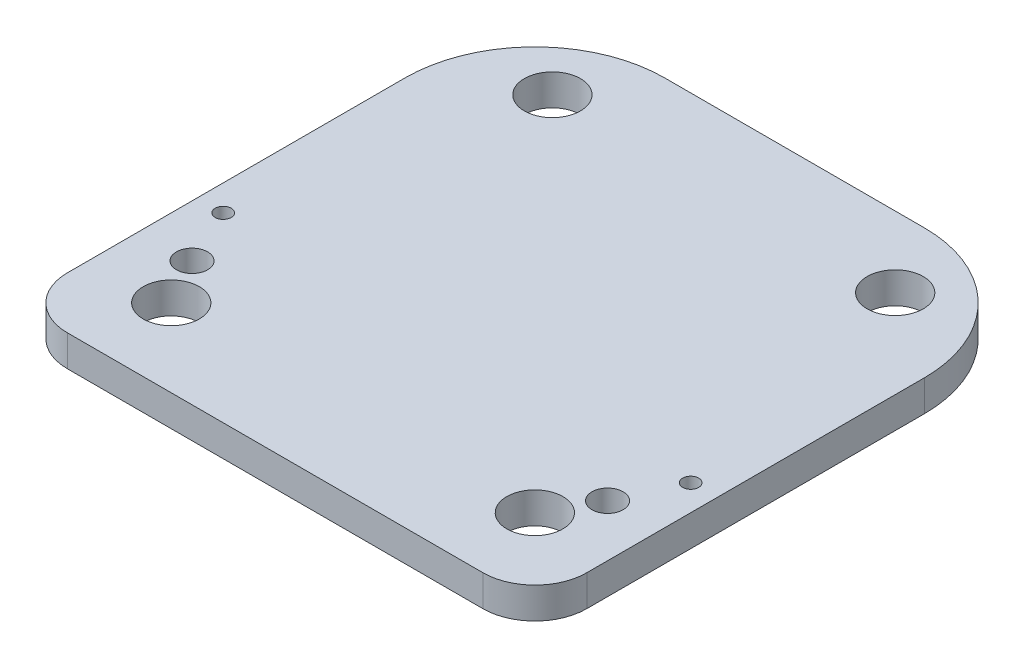
ISO-10303-21;
HEADER;
FILE_DESCRIPTION(('STEP AP214'),'2;1');
FILE_NAME('part.step','',(''),(''),'','','');
FILE_SCHEMA(('AUTOMOTIVE_DESIGN { 1 0 10303 214 1 1 1 1 }'));
ENDSEC;
DATA;
#1=APPLICATION_CONTEXT('core data for automotive mechanical design processes');
#2=APPLICATION_PROTOCOL_DEFINITION('international standard','automotive_design',2000,#1);
#3=PRODUCT_CONTEXT('',#1,'mechanical');
#4=PRODUCT('Part','Part','',(#3));
#5=PRODUCT_RELATED_PRODUCT_CATEGORY('part','',(#4));
#6=PRODUCT_DEFINITION_FORMATION('','',#4);
#7=PRODUCT_DEFINITION_CONTEXT('part definition',#1,'design');
#8=PRODUCT_DEFINITION('design','',#6,#7);
#9=PRODUCT_DEFINITION_SHAPE('','',#8);
#10=(LENGTH_UNIT() NAMED_UNIT(*) SI_UNIT(.MILLI.,.METRE.));
#11=(NAMED_UNIT(*) PLANE_ANGLE_UNIT() SI_UNIT($,.RADIAN.));
#12=(NAMED_UNIT(*) SI_UNIT($,.STERADIAN.) SOLID_ANGLE_UNIT());
#13=UNCERTAINTY_MEASURE_WITH_UNIT(LENGTH_MEASURE(1.E-05),#10,'distance_accuracy_value','');
#14=(GEOMETRIC_REPRESENTATION_CONTEXT(3) GLOBAL_UNCERTAINTY_ASSIGNED_CONTEXT((#13)) GLOBAL_UNIT_ASSIGNED_CONTEXT((#10,
#11,#12)) REPRESENTATION_CONTEXT('',''));
#15=CARTESIAN_POINT('',(0.,0.,0.));
#16=DIRECTION('',(0.,0.,1.));
#17=DIRECTION('',(1.,0.,0.));
#18=AXIS2_PLACEMENT_3D('',#15,#16,#17);
#19=CARTESIAN_POINT('',(10.,-6.,-10.));
#20=DIRECTION('',(0.,1.,0.));
#21=DIRECTION('',(0.,0.,1.));
#22=AXIS2_PLACEMENT_3D('',#19,#20,#21);
#23=CYLINDRICAL_SURFACE('',#22,10.);
#24=CARTESIAN_POINT('',(10.,0.,-10.));
#25=DIRECTION('',(0.,1.,0.));
#26=DIRECTION('',(0.,0.,1.));
#27=AXIS2_PLACEMENT_3D('',#24,#25,#26);
#28=CIRCLE('',#27,10.);
#29=CARTESIAN_POINT('',(0.,0.,-9.99999999999999));
#30=VERTEX_POINT('',#29);
#31=CARTESIAN_POINT('',(10.,0.,0.));
#32=VERTEX_POINT('',#31);
#33=EDGE_CURVE('E144',#30,#32,#28,.T.);
#34=ORIENTED_EDGE('',*,*,#33,.F.);
#35=DIRECTION('',(0.,1.,0.));
#36=VECTOR('',#35,1.);
#37=CARTESIAN_POINT('',(0.,-6.,-9.99999999999999));
#38=LINE('',#37,#36);
#39=CARTESIAN_POINT('',(0.,-6.,-9.99999999999999));
#40=VERTEX_POINT('',#39);
#41=EDGE_CURVE('E11',#40,#30,#38,.T.);
#42=ORIENTED_EDGE('',*,*,#41,.F.);
#43=CARTESIAN_POINT('',(10.,-6.,-10.));
#44=DIRECTION('',(0.,1.,0.));
#45=DIRECTION('',(0.,0.,1.));
#46=AXIS2_PLACEMENT_3D('',#43,#44,#45);
#47=CIRCLE('',#46,10.);
#48=CARTESIAN_POINT('',(10.,-6.,0.));
#49=VERTEX_POINT('',#48);
#50=EDGE_CURVE('E167',#40,#49,#47,.T.);
#51=ORIENTED_EDGE('',*,*,#50,.T.);
#52=DIRECTION('',(0.,1.,0.));
#53=VECTOR('',#52,1.);
#54=CARTESIAN_POINT('',(10.,-6.,0.));
#55=LINE('',#54,#53);
#56=EDGE_CURVE('E44',#49,#32,#55,.T.);
#57=ORIENTED_EDGE('',*,*,#56,.T.);
#58=EDGE_LOOP('',(#34,#42,#51,#57));
#59=FACE_BOUND('',#58,.T.);
#60=ADVANCED_FACE('F41',(#59),#23,.T.);
#61=CARTESIAN_POINT('',(0.,-6.,-75.));
#62=DIRECTION('',(-1.,0.,0.));
#63=DIRECTION('',(0.,0.,1.));
#64=AXIS2_PLACEMENT_3D('',#61,#62,#63);
#65=PLANE('',#64);
#66=DIRECTION('',(0.,0.,1.));
#67=VECTOR('',#66,1.);
#68=CARTESIAN_POINT('',(0.,0.,-75.));
#69=LINE('',#68,#67);
#70=CARTESIAN_POINT('',(0.,0.,-75.));
#71=VERTEX_POINT('',#70);
#72=EDGE_CURVE('E165',#71,#30,#69,.T.);
#73=ORIENTED_EDGE('',*,*,#72,.F.);
#74=DIRECTION('',(0.,1.,0.));
#75=VECTOR('',#74,1.);
#76=CARTESIAN_POINT('',(0.,-6.,-75.));
#77=LINE('',#76,#75);
#78=CARTESIAN_POINT('',(0.,-6.,-75.));
#79=VERTEX_POINT('',#78);
#80=EDGE_CURVE('E50',#79,#71,#77,.T.);
#81=ORIENTED_EDGE('',*,*,#80,.F.);
#82=DIRECTION('',(0.,0.,1.));
#83=VECTOR('',#82,1.);
#84=CARTESIAN_POINT('',(0.,-6.,-75.));
#85=LINE('',#84,#83);
#86=EDGE_CURVE('E131',#79,#40,#85,.T.);
#87=ORIENTED_EDGE('',*,*,#86,.T.);
#88=ORIENTED_EDGE('',*,*,#41,.T.);
#89=EDGE_LOOP('',(#73,#81,#87,#88));
#90=FACE_BOUND('',#89,.T.);
#91=ADVANCED_FACE('F179',(#90),#65,.T.);
#92=CARTESIAN_POINT('',(25.,-6.,-75.));
#93=DIRECTION('',(0.,1.,0.));
#94=DIRECTION('',(0.,0.,1.));
#95=AXIS2_PLACEMENT_3D('',#92,#93,#94);
#96=CYLINDRICAL_SURFACE('',#95,25.);
#97=CARTESIAN_POINT('',(25.,0.,-75.));
#98=DIRECTION('',(0.,1.,0.));
#99=DIRECTION('',(0.,0.,1.));
#100=AXIS2_PLACEMENT_3D('',#97,#98,#99);
#101=CIRCLE('',#100,25.);
#102=CARTESIAN_POINT('',(25.,0.,-100.));
#103=VERTEX_POINT('',#102);
#104=EDGE_CURVE('E117',#103,#71,#101,.T.);
#105=ORIENTED_EDGE('',*,*,#104,.F.);
#106=DIRECTION('',(0.,1.,0.));
#107=VECTOR('',#106,1.);
#108=CARTESIAN_POINT('',(25.,-6.,-100.));
#109=LINE('',#108,#107);
#110=CARTESIAN_POINT('',(25.,-6.,-100.));
#111=VERTEX_POINT('',#110);
#112=EDGE_CURVE('E112',#111,#103,#109,.T.);
#113=ORIENTED_EDGE('',*,*,#112,.F.);
#114=CARTESIAN_POINT('',(25.,-6.,-75.));
#115=DIRECTION('',(0.,1.,0.));
#116=DIRECTION('',(0.,0.,1.));
#117=AXIS2_PLACEMENT_3D('',#114,#115,#116);
#118=CIRCLE('',#117,25.);
#119=EDGE_CURVE('E115',#111,#79,#118,.T.);
#120=ORIENTED_EDGE('',*,*,#119,.T.);
#121=ORIENTED_EDGE('',*,*,#80,.T.);
#122=EDGE_LOOP('',(#105,#113,#120,#121));
#123=FACE_BOUND('',#122,.T.);
#124=ADVANCED_FACE('F114',(#123),#96,.T.);
#125=CARTESIAN_POINT('',(75.,-6.,-100.));
#126=DIRECTION('',(0.,0.,-1.));
#127=DIRECTION('',(-1.,0.,0.));
#128=AXIS2_PLACEMENT_3D('',#125,#126,#127);
#129=PLANE('',#128);
#130=DIRECTION('',(-1.,0.,0.));
#131=VECTOR('',#130,1.);
#132=CARTESIAN_POINT('',(75.,0.,-100.));
#133=LINE('',#132,#131);
#134=CARTESIAN_POINT('',(75.,0.,-100.));
#135=VERTEX_POINT('',#134);
#136=EDGE_CURVE('E161',#135,#103,#133,.T.);
#137=ORIENTED_EDGE('',*,*,#136,.F.);
#138=DIRECTION('',(0.,1.,0.));
#139=VECTOR('',#138,1.);
#140=CARTESIAN_POINT('',(75.,-6.,-100.));
#141=LINE('',#140,#139);
#142=CARTESIAN_POINT('',(75.,-6.,-100.));
#143=VERTEX_POINT('',#142);
#144=EDGE_CURVE('E123',#143,#135,#141,.T.);
#145=ORIENTED_EDGE('',*,*,#144,.F.);
#146=DIRECTION('',(-1.,0.,0.));
#147=VECTOR('',#146,1.);
#148=CARTESIAN_POINT('',(75.,-6.,-100.));
#149=LINE('',#148,#147);
#150=EDGE_CURVE('E129',#143,#111,#149,.T.);
#151=ORIENTED_EDGE('',*,*,#150,.T.);
#152=ORIENTED_EDGE('',*,*,#112,.T.);
#153=EDGE_LOOP('',(#137,#145,#151,#152));
#154=FACE_BOUND('',#153,.T.);
#155=ADVANCED_FACE('F134',(#154),#129,.T.);
#156=CARTESIAN_POINT('',(75.,-6.,-75.));
#157=DIRECTION('',(0.,1.,0.));
#158=DIRECTION('',(0.,0.,1.));
#159=AXIS2_PLACEMENT_3D('',#156,#157,#158);
#160=CYLINDRICAL_SURFACE('',#159,25.);
#161=CARTESIAN_POINT('',(75.,0.,-75.));
#162=DIRECTION('',(0.,1.,0.));
#163=DIRECTION('',(0.,0.,1.));
#164=AXIS2_PLACEMENT_3D('',#161,#162,#163);
#165=CIRCLE('',#164,25.);
#166=CARTESIAN_POINT('',(100.,0.,-75.));
#167=VERTEX_POINT('',#166);
#168=EDGE_CURVE('E158',#167,#135,#165,.T.);
#169=ORIENTED_EDGE('',*,*,#168,.F.);
#170=DIRECTION('',(0.,1.,0.));
#171=VECTOR('',#170,1.);
#172=CARTESIAN_POINT('',(100.,-6.,-75.));
#173=LINE('',#172,#171);
#174=CARTESIAN_POINT('',(100.,-6.,-75.));
#175=VERTEX_POINT('',#174);
#176=EDGE_CURVE('E171',#175,#167,#173,.T.);
#177=ORIENTED_EDGE('',*,*,#176,.F.);
#178=CARTESIAN_POINT('',(75.,-6.,-75.));
#179=DIRECTION('',(0.,1.,0.));
#180=DIRECTION('',(0.,0.,1.));
#181=AXIS2_PLACEMENT_3D('',#178,#179,#180);
#182=CIRCLE('',#181,25.);
#183=EDGE_CURVE('E136',#175,#143,#182,.T.);
#184=ORIENTED_EDGE('',*,*,#183,.T.);
#185=ORIENTED_EDGE('',*,*,#144,.T.);
#186=EDGE_LOOP('',(#169,#177,#184,#185));
#187=FACE_BOUND('',#186,.T.);
#188=ADVANCED_FACE('F192',(#187),#160,.T.);
#189=CARTESIAN_POINT('',(100.,-6.,-10.));
#190=DIRECTION('',(1.,0.,0.));
#191=DIRECTION('',(0.,0.,-1.));
#192=AXIS2_PLACEMENT_3D('',#189,#190,#191);
#193=PLANE('',#192);
#194=DIRECTION('',(0.,0.,-1.));
#195=VECTOR('',#194,1.);
#196=CARTESIAN_POINT('',(100.,0.,-10.));
#197=LINE('',#196,#195);
#198=CARTESIAN_POINT('',(100.,0.,-10.));
#199=VERTEX_POINT('',#198);
#200=EDGE_CURVE('E155',#199,#167,#197,.T.);
#201=ORIENTED_EDGE('',*,*,#200,.F.);
#202=DIRECTION('',(0.,1.,0.));
#203=VECTOR('',#202,1.);
#204=CARTESIAN_POINT('',(100.,-6.,-10.));
#205=LINE('',#204,#203);
#206=CARTESIAN_POINT('',(100.,-6.,-10.));
#207=VERTEX_POINT('',#206);
#208=EDGE_CURVE('E173',#207,#199,#205,.T.);
#209=ORIENTED_EDGE('',*,*,#208,.F.);
#210=DIRECTION('',(0.,0.,-1.));
#211=VECTOR('',#210,1.);
#212=CARTESIAN_POINT('',(100.,-6.,-10.));
#213=LINE('',#212,#211);
#214=EDGE_CURVE('E139',#207,#175,#213,.T.);
#215=ORIENTED_EDGE('',*,*,#214,.T.);
#216=ORIENTED_EDGE('',*,*,#176,.T.);
#217=EDGE_LOOP('',(#201,#209,#215,#216));
#218=FACE_BOUND('',#217,.T.);
#219=ADVANCED_FACE('F195',(#218),#193,.T.);
#220=CARTESIAN_POINT('',(90.,-6.,-10.));
#221=DIRECTION('',(0.,1.,0.));
#222=DIRECTION('',(0.,0.,1.));
#223=AXIS2_PLACEMENT_3D('',#220,#221,#222);
#224=CYLINDRICAL_SURFACE('',#223,10.);
#225=CARTESIAN_POINT('',(90.,0.,-10.));
#226=DIRECTION('',(0.,1.,0.));
#227=DIRECTION('',(0.,0.,1.));
#228=AXIS2_PLACEMENT_3D('',#225,#226,#227);
#229=CIRCLE('',#228,10.);
#230=CARTESIAN_POINT('',(90.,0.,0.));
#231=VERTEX_POINT('',#230);
#232=EDGE_CURVE('E152',#231,#199,#229,.T.);
#233=ORIENTED_EDGE('',*,*,#232,.F.);
#234=DIRECTION('',(0.,1.,0.));
#235=VECTOR('',#234,1.);
#236=CARTESIAN_POINT('',(90.,-6.,0.));
#237=LINE('',#236,#235);
#238=CARTESIAN_POINT('',(90.,-6.,0.));
#239=VERTEX_POINT('',#238);
#240=EDGE_CURVE('E174',#239,#231,#237,.T.);
#241=ORIENTED_EDGE('',*,*,#240,.F.);
#242=CARTESIAN_POINT('',(90.,-6.,-10.));
#243=DIRECTION('',(0.,1.,0.));
#244=DIRECTION('',(0.,0.,1.));
#245=AXIS2_PLACEMENT_3D('',#242,#243,#244);
#246=CIRCLE('',#245,10.);
#247=EDGE_CURVE('E303',#239,#207,#246,.T.);
#248=ORIENTED_EDGE('',*,*,#247,.T.);
#249=ORIENTED_EDGE('',*,*,#208,.T.);
#250=EDGE_LOOP('',(#233,#241,#248,#249));
#251=FACE_BOUND('',#250,.T.);
#252=ADVANCED_FACE('F199',(#251),#224,.T.);
#253=CARTESIAN_POINT('',(10.,-6.,0.));
#254=DIRECTION('',(0.,0.,1.));
#255=DIRECTION('',(1.,0.,0.));
#256=AXIS2_PLACEMENT_3D('',#253,#254,#255);
#257=PLANE('',#256);
#258=DIRECTION('',(1.,0.,0.));
#259=VECTOR('',#258,1.);
#260=CARTESIAN_POINT('',(10.,0.,0.));
#261=LINE('',#260,#259);
#262=EDGE_CURVE('E147',#32,#231,#261,.T.);
#263=ORIENTED_EDGE('',*,*,#262,.F.);
#264=ORIENTED_EDGE('',*,*,#56,.F.);
#265=DIRECTION('',(1.,0.,0.));
#266=VECTOR('',#265,1.);
#267=CARTESIAN_POINT('',(10.,-6.,0.));
#268=LINE('',#267,#266);
#269=EDGE_CURVE('E301',#49,#239,#268,.T.);
#270=ORIENTED_EDGE('',*,*,#269,.T.);
#271=ORIENTED_EDGE('',*,*,#240,.T.);
#272=EDGE_LOOP('',(#263,#264,#270,#271));
#273=FACE_BOUND('',#272,.T.);
#274=ADVANCED_FACE('F176',(#273),#257,.T.);
#275=CARTESIAN_POINT('',(10.,-6.,-10.));
#276=DIRECTION('',(0.,1.,0.));
#277=DIRECTION('',(0.,0.,1.));
#278=AXIS2_PLACEMENT_3D('',#275,#276,#277);
#279=PLANE('',#278);
#280=CARTESIAN_POINT('',(10.0000000000031,-6.,-24.0000000000126));
#281=DIRECTION('',(0.,1.,0.));
#282=DIRECTION('',(0.,0.,1.));
#283=AXIS2_PLACEMENT_3D('',#280,#281,#282);
#284=CIRCLE('',#283,3.);
#285=CARTESIAN_POINT('',(10.0000000000031,-6.,-21.0000000000126));
#286=VERTEX_POINT('',#285);
#287=EDGE_CURVE('E250',#286,#286,#284,.T.);
#288=ORIENTED_EDGE('',*,*,#287,.T.);
#289=EDGE_LOOP('',(#288));
#290=FACE_BOUND('',#289,.T.);
#291=CARTESIAN_POINT('',(90.0000000000031,-6.,-24.0000000000126));
#292=DIRECTION('',(0.,1.,0.));
#293=DIRECTION('',(0.,0.,1.));
#294=AXIS2_PLACEMENT_3D('',#291,#292,#293);
#295=CIRCLE('',#294,3.00000000000001);
#296=CARTESIAN_POINT('',(90.0000000000031,-6.,-21.0000000000126));
#297=VERTEX_POINT('',#296);
#298=EDGE_CURVE('E258',#297,#297,#295,.T.);
#299=ORIENTED_EDGE('',*,*,#298,.T.);
#300=EDGE_LOOP('',(#299));
#301=FACE_BOUND('',#300,.T.);
#302=CARTESIAN_POINT('',(95.0000000000004,-6.,-35.));
#303=DIRECTION('',(0.,-1.,0.));
#304=DIRECTION('',(0.,0.,-1.));
#305=AXIS2_PLACEMENT_3D('',#302,#303,#304);
#306=CIRCLE('',#305,1.54999999999958);
#307=CARTESIAN_POINT('',(95.0000000000004,-6.,-36.5499999999996));
#308=VERTEX_POINT('',#307);
#309=EDGE_CURVE('E261',#308,#308,#306,.T.);
#310=ORIENTED_EDGE('',*,*,#309,.F.);
#311=EDGE_LOOP('',(#310));
#312=FACE_BOUND('',#311,.T.);
#313=CARTESIAN_POINT('',(5.00000000000045,-6.,-35.));
#314=DIRECTION('',(0.,-1.,0.));
#315=DIRECTION('',(0.,0.,-1.));
#316=AXIS2_PLACEMENT_3D('',#313,#314,#315);
#317=CIRCLE('',#316,1.5499999999996);
#318=CARTESIAN_POINT('',(5.00000000000045,-6.,-36.5499999999996));
#319=VERTEX_POINT('',#318);
#320=EDGE_CURVE('E267',#319,#319,#317,.T.);
#321=ORIENTED_EDGE('',*,*,#320,.F.);
#322=EDGE_LOOP('',(#321));
#323=FACE_BOUND('',#322,.T.);
#324=CARTESIAN_POINT('',(84.9999999999983,-6.,-15.0000000000126));
#325=DIRECTION('',(0.,1.,0.));
#326=DIRECTION('',(0.,0.,1.));
#327=AXIS2_PLACEMENT_3D('',#324,#325,#326);
#328=CIRCLE('',#327,5.39999999999999);
#329=CARTESIAN_POINT('',(84.9999999999983,-6.,-9.60000000001258));
#330=VERTEX_POINT('',#329);
#331=EDGE_CURVE('E276',#330,#330,#328,.T.);
#332=ORIENTED_EDGE('',*,*,#331,.T.);
#333=EDGE_LOOP('',(#332));
#334=FACE_BOUND('',#333,.T.);
#335=CARTESIAN_POINT('',(15.0000000000762,-6.,-15.0000000000055));
#336=DIRECTION('',(0.,1.,0.));
#337=DIRECTION('',(0.,0.,1.));
#338=AXIS2_PLACEMENT_3D('',#335,#336,#337);
#339=CIRCLE('',#338,5.40000000000002);
#340=CARTESIAN_POINT('',(15.0000000000762,-6.,-9.60000000000549));
#341=VERTEX_POINT('',#340);
#342=EDGE_CURVE('E282',#341,#341,#339,.T.);
#343=ORIENTED_EDGE('',*,*,#342,.T.);
#344=EDGE_LOOP('',(#343));
#345=FACE_BOUND('',#344,.T.);
#346=CARTESIAN_POINT('',(82.9999999999983,-6.,-86.3783455371567));
#347=DIRECTION('',(0.,1.,0.));
#348=DIRECTION('',(0.,0.,1.));
#349=AXIS2_PLACEMENT_3D('',#346,#347,#348);
#350=CIRCLE('',#349,5.39999999999997);
#351=CARTESIAN_POINT('',(82.9999999999983,-6.,-80.9783455371567));
#352=VERTEX_POINT('',#351);
#353=EDGE_CURVE('E288',#352,#352,#350,.T.);
#354=ORIENTED_EDGE('',*,*,#353,.T.);
#355=EDGE_LOOP('',(#354));
#356=FACE_BOUND('',#355,.T.);
#357=CARTESIAN_POINT('',(17.0000000000761,-6.,-86.3783455371497));
#358=DIRECTION('',(0.,1.,0.));
#359=DIRECTION('',(0.,0.,1.));
#360=AXIS2_PLACEMENT_3D('',#357,#358,#359);
#361=CIRCLE('',#360,5.40000000000002);
#362=CARTESIAN_POINT('',(17.0000000000761,-6.,-80.9783455371497));
#363=VERTEX_POINT('',#362);
#364=EDGE_CURVE('E148',#363,#363,#361,.T.);
#365=ORIENTED_EDGE('',*,*,#364,.T.);
#366=EDGE_LOOP('',(#365));
#367=FACE_BOUND('',#366,.T.);
#368=ORIENTED_EDGE('',*,*,#50,.F.);
#369=ORIENTED_EDGE('',*,*,#86,.F.);
#370=ORIENTED_EDGE('',*,*,#119,.F.);
#371=ORIENTED_EDGE('',*,*,#150,.F.);
#372=ORIENTED_EDGE('',*,*,#183,.F.);
#373=ORIENTED_EDGE('',*,*,#214,.F.);
#374=ORIENTED_EDGE('',*,*,#247,.F.);
#375=ORIENTED_EDGE('',*,*,#269,.F.);
#376=EDGE_LOOP('',(#368,#369,#370,#371,#372,#373,#374,#375));
#377=FACE_BOUND('',#376,.T.);
#378=ADVANCED_FACE('F127',(#290,#301,#312,#323,#334,#345,#356,#367,#377),#279,.F.);
#379=CARTESIAN_POINT('',(10.,0.,-10.));
#380=DIRECTION('',(0.,1.,0.));
#381=DIRECTION('',(0.,0.,1.));
#382=AXIS2_PLACEMENT_3D('',#379,#380,#381);
#383=PLANE('',#382);
#384=CARTESIAN_POINT('',(10.0000000000031,0.,-24.0000000000126));
#385=DIRECTION('',(0.,1.,0.));
#386=DIRECTION('',(0.,0.,1.));
#387=AXIS2_PLACEMENT_3D('',#384,#385,#386);
#388=CIRCLE('',#387,3.);
#389=CARTESIAN_POINT('',(10.0000000000031,0.,-21.0000000000126));
#390=VERTEX_POINT('',#389);
#391=EDGE_CURVE('E253',#390,#390,#388,.T.);
#392=ORIENTED_EDGE('',*,*,#391,.F.);
#393=EDGE_LOOP('',(#392));
#394=FACE_BOUND('',#393,.T.);
#395=CARTESIAN_POINT('',(90.0000000000031,0.,-24.0000000000126));
#396=DIRECTION('',(0.,1.,0.));
#397=DIRECTION('',(0.,0.,1.));
#398=AXIS2_PLACEMENT_3D('',#395,#396,#397);
#399=CIRCLE('',#398,3.00000000000001);
#400=CARTESIAN_POINT('',(90.0000000000031,0.,-21.0000000000126));
#401=VERTEX_POINT('',#400);
#402=EDGE_CURVE('E255',#401,#401,#399,.T.);
#403=ORIENTED_EDGE('',*,*,#402,.F.);
#404=EDGE_LOOP('',(#403));
#405=FACE_BOUND('',#404,.T.);
#406=CARTESIAN_POINT('',(95.0000000000004,0.,-35.));
#407=DIRECTION('',(0.,-1.,0.));
#408=DIRECTION('',(0.,0.,-1.));
#409=AXIS2_PLACEMENT_3D('',#406,#407,#408);
#410=CIRCLE('',#409,1.54999999999958);
#411=CARTESIAN_POINT('',(95.0000000000004,0.,-36.5499999999996));
#412=VERTEX_POINT('',#411);
#413=EDGE_CURVE('E264',#412,#412,#410,.T.);
#414=ORIENTED_EDGE('',*,*,#413,.T.);
#415=EDGE_LOOP('',(#414));
#416=FACE_BOUND('',#415,.T.);
#417=CARTESIAN_POINT('',(5.00000000000045,0.,-35.));
#418=DIRECTION('',(0.,-1.,0.));
#419=DIRECTION('',(0.,0.,-1.));
#420=AXIS2_PLACEMENT_3D('',#417,#418,#419);
#421=CIRCLE('',#420,1.5499999999996);
#422=CARTESIAN_POINT('',(5.00000000000045,0.,-36.5499999999996));
#423=VERTEX_POINT('',#422);
#424=EDGE_CURVE('E270',#423,#423,#421,.T.);
#425=ORIENTED_EDGE('',*,*,#424,.T.);
#426=EDGE_LOOP('',(#425));
#427=FACE_BOUND('',#426,.T.);
#428=CARTESIAN_POINT('',(84.9999999999983,0.,-15.0000000000126));
#429=DIRECTION('',(0.,1.,0.));
#430=DIRECTION('',(0.,0.,1.));
#431=AXIS2_PLACEMENT_3D('',#428,#429,#430);
#432=CIRCLE('',#431,5.39999999999999);
#433=CARTESIAN_POINT('',(84.9999999999983,0.,-9.60000000001258));
#434=VERTEX_POINT('',#433);
#435=EDGE_CURVE('E273',#434,#434,#432,.T.);
#436=ORIENTED_EDGE('',*,*,#435,.F.);
#437=EDGE_LOOP('',(#436));
#438=FACE_BOUND('',#437,.T.);
#439=CARTESIAN_POINT('',(15.0000000000762,0.,-15.0000000000055));
#440=DIRECTION('',(0.,1.,0.));
#441=DIRECTION('',(0.,0.,1.));
#442=AXIS2_PLACEMENT_3D('',#439,#440,#441);
#443=CIRCLE('',#442,5.40000000000002);
#444=CARTESIAN_POINT('',(15.0000000000762,0.,-9.60000000000549));
#445=VERTEX_POINT('',#444);
#446=EDGE_CURVE('E279',#445,#445,#443,.T.);
#447=ORIENTED_EDGE('',*,*,#446,.F.);
#448=EDGE_LOOP('',(#447));
#449=FACE_BOUND('',#448,.T.);
#450=CARTESIAN_POINT('',(82.9999999999983,0.,-86.3783455371567));
#451=DIRECTION('',(0.,1.,0.));
#452=DIRECTION('',(0.,0.,1.));
#453=AXIS2_PLACEMENT_3D('',#450,#451,#452);
#454=CIRCLE('',#453,5.39999999999997);
#455=CARTESIAN_POINT('',(82.9999999999983,0.,-80.9783455371567));
#456=VERTEX_POINT('',#455);
#457=EDGE_CURVE('E285',#456,#456,#454,.T.);
#458=ORIENTED_EDGE('',*,*,#457,.F.);
#459=EDGE_LOOP('',(#458));
#460=FACE_BOUND('',#459,.T.);
#461=CARTESIAN_POINT('',(17.0000000000761,0.,-86.3783455371497));
#462=DIRECTION('',(0.,1.,0.));
#463=DIRECTION('',(0.,0.,1.));
#464=AXIS2_PLACEMENT_3D('',#461,#462,#463);
#465=CIRCLE('',#464,5.40000000000002);
#466=CARTESIAN_POINT('',(17.0000000000761,0.,-80.9783455371497));
#467=VERTEX_POINT('',#466);
#468=EDGE_CURVE('E291',#467,#467,#465,.T.);
#469=ORIENTED_EDGE('',*,*,#468,.F.);
#470=EDGE_LOOP('',(#469));
#471=FACE_BOUND('',#470,.T.);
#472=ORIENTED_EDGE('',*,*,#33,.T.);
#473=ORIENTED_EDGE('',*,*,#262,.T.);
#474=ORIENTED_EDGE('',*,*,#232,.T.);
#475=ORIENTED_EDGE('',*,*,#200,.T.);
#476=ORIENTED_EDGE('',*,*,#168,.T.);
#477=ORIENTED_EDGE('',*,*,#136,.T.);
#478=ORIENTED_EDGE('',*,*,#104,.T.);
#479=ORIENTED_EDGE('',*,*,#72,.T.);
#480=EDGE_LOOP('',(#472,#473,#474,#475,#476,#477,#478,#479));
#481=FACE_BOUND('',#480,.T.);
#482=ADVANCED_FACE('F178',(#394,#405,#416,#427,#438,#449,#460,#471,#481),#383,.T.);
#483=CARTESIAN_POINT('',(17.0000000000761,-6.,-86.3783455371497));
#484=DIRECTION('',(0.,1.,0.));
#485=DIRECTION('',(0.,0.,1.));
#486=AXIS2_PLACEMENT_3D('',#483,#484,#485);
#487=CYLINDRICAL_SURFACE('',#486,5.40000000000002);
#488=ORIENTED_EDGE('',*,*,#364,.F.);
#489=EDGE_LOOP('',(#488));
#490=FACE_BOUND('',#489,.T.);
#491=ORIENTED_EDGE('',*,*,#468,.T.);
#492=EDGE_LOOP('',(#491));
#493=FACE_BOUND('',#492,.T.);
#494=ADVANCED_FACE('F211',(#490,#493),#487,.F.);
#495=CARTESIAN_POINT('',(82.9999999999983,-6.,-86.3783455371567));
#496=DIRECTION('',(0.,1.,0.));
#497=DIRECTION('',(0.,0.,1.));
#498=AXIS2_PLACEMENT_3D('',#495,#496,#497);
#499=CYLINDRICAL_SURFACE('',#498,5.39999999999997);
#500=ORIENTED_EDGE('',*,*,#353,.F.);
#501=EDGE_LOOP('',(#500));
#502=FACE_BOUND('',#501,.T.);
#503=ORIENTED_EDGE('',*,*,#457,.T.);
#504=EDGE_LOOP('',(#503));
#505=FACE_BOUND('',#504,.T.);
#506=ADVANCED_FACE('F218',(#502,#505),#499,.F.);
#507=CARTESIAN_POINT('',(15.0000000000762,-6.,-15.0000000000055));
#508=DIRECTION('',(0.,1.,0.));
#509=DIRECTION('',(0.,0.,1.));
#510=AXIS2_PLACEMENT_3D('',#507,#508,#509);
#511=CYLINDRICAL_SURFACE('',#510,5.40000000000002);
#512=ORIENTED_EDGE('',*,*,#342,.F.);
#513=EDGE_LOOP('',(#512));
#514=FACE_BOUND('',#513,.T.);
#515=ORIENTED_EDGE('',*,*,#446,.T.);
#516=EDGE_LOOP('',(#515));
#517=FACE_BOUND('',#516,.T.);
#518=ADVANCED_FACE('F222',(#514,#517),#511,.F.);
#519=CARTESIAN_POINT('',(84.9999999999983,-6.,-15.0000000000126));
#520=DIRECTION('',(0.,1.,0.));
#521=DIRECTION('',(0.,0.,1.));
#522=AXIS2_PLACEMENT_3D('',#519,#520,#521);
#523=CYLINDRICAL_SURFACE('',#522,5.39999999999999);
#524=ORIENTED_EDGE('',*,*,#331,.F.);
#525=EDGE_LOOP('',(#524));
#526=FACE_BOUND('',#525,.T.);
#527=ORIENTED_EDGE('',*,*,#435,.T.);
#528=EDGE_LOOP('',(#527));
#529=FACE_BOUND('',#528,.T.);
#530=ADVANCED_FACE('F226',(#526,#529),#523,.F.);
#531=CARTESIAN_POINT('',(5.00000000000045,0.,-35.));
#532=DIRECTION('',(0.,-1.,0.));
#533=DIRECTION('',(0.,0.,-1.));
#534=AXIS2_PLACEMENT_3D('',#531,#532,#533);
#535=CYLINDRICAL_SURFACE('',#534,1.5499999999996);
#536=ORIENTED_EDGE('',*,*,#424,.F.);
#537=EDGE_LOOP('',(#536));
#538=FACE_BOUND('',#537,.T.);
#539=ORIENTED_EDGE('',*,*,#320,.T.);
#540=EDGE_LOOP('',(#539));
#541=FACE_BOUND('',#540,.T.);
#542=ADVANCED_FACE('F230',(#538,#541),#535,.F.);
#543=CARTESIAN_POINT('',(95.0000000000004,0.,-35.));
#544=DIRECTION('',(0.,-1.,0.));
#545=DIRECTION('',(0.,0.,-1.));
#546=AXIS2_PLACEMENT_3D('',#543,#544,#545);
#547=CYLINDRICAL_SURFACE('',#546,1.54999999999958);
#548=ORIENTED_EDGE('',*,*,#413,.F.);
#549=EDGE_LOOP('',(#548));
#550=FACE_BOUND('',#549,.T.);
#551=ORIENTED_EDGE('',*,*,#309,.T.);
#552=EDGE_LOOP('',(#551));
#553=FACE_BOUND('',#552,.T.);
#554=ADVANCED_FACE('F234',(#550,#553),#547,.F.);
#555=CARTESIAN_POINT('',(90.0000000000031,-6.,-24.0000000000126));
#556=DIRECTION('',(0.,1.,0.));
#557=DIRECTION('',(0.,0.,1.));
#558=AXIS2_PLACEMENT_3D('',#555,#556,#557);
#559=CYLINDRICAL_SURFACE('',#558,3.00000000000001);
#560=ORIENTED_EDGE('',*,*,#298,.F.);
#561=EDGE_LOOP('',(#560));
#562=FACE_BOUND('',#561,.T.);
#563=ORIENTED_EDGE('',*,*,#402,.T.);
#564=EDGE_LOOP('',(#563));
#565=FACE_BOUND('',#564,.T.);
#566=ADVANCED_FACE('F238',(#562,#565),#559,.F.);
#567=CARTESIAN_POINT('',(10.0000000000031,-6.,-24.0000000000126));
#568=DIRECTION('',(0.,1.,0.));
#569=DIRECTION('',(0.,0.,1.));
#570=AXIS2_PLACEMENT_3D('',#567,#568,#569);
#571=CYLINDRICAL_SURFACE('',#570,3.);
#572=ORIENTED_EDGE('',*,*,#287,.F.);
#573=EDGE_LOOP('',(#572));
#574=FACE_BOUND('',#573,.T.);
#575=ORIENTED_EDGE('',*,*,#391,.T.);
#576=EDGE_LOOP('',(#575));
#577=FACE_BOUND('',#576,.T.);
#578=ADVANCED_FACE('F242',(#574,#577),#571,.F.);
#579=CLOSED_SHELL('',(#60,#91,#124,#155,#188,#219,#252,#274,#378,#482,#494,#506,#518,#530,#542,
#554,#566,#578));
#580=MANIFOLD_SOLID_BREP('B2',#579);
#581=ADVANCED_BREP_SHAPE_REPRESENTATION('',(#18,#580),#14);
#582=SHAPE_DEFINITION_REPRESENTATION(#9,#581);
ENDSEC;
END-ISO-10303-21;
